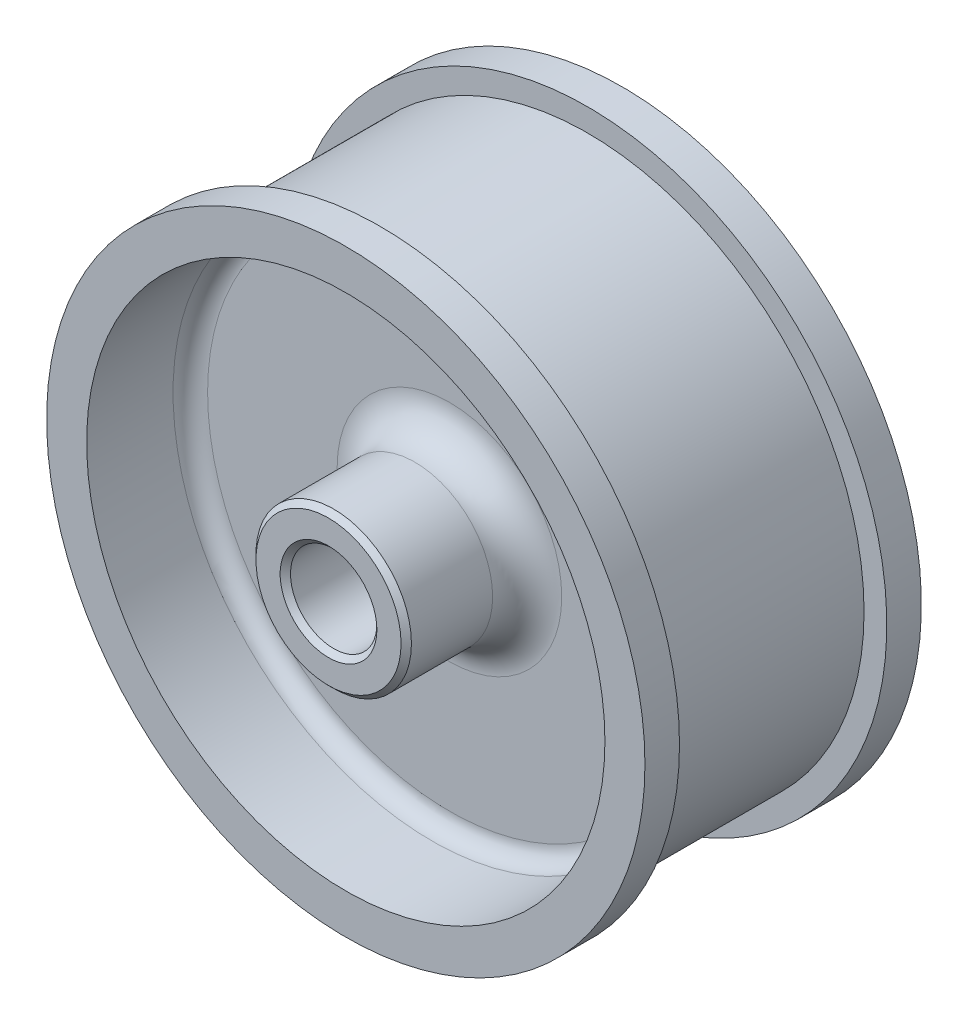
ISO-10303-21;
HEADER;
FILE_DESCRIPTION(('STEP AP214'),'2;1');
FILE_NAME('part.step','',(''),(''),'','','');
FILE_SCHEMA(('AUTOMOTIVE_DESIGN { 1 0 10303 214 1 1 1 1 }'));
ENDSEC;
DATA;
#1=APPLICATION_CONTEXT('core data for automotive mechanical design processes');
#2=APPLICATION_PROTOCOL_DEFINITION('international standard','automotive_design',2000,#1);
#3=PRODUCT_CONTEXT('',#1,'mechanical');
#4=PRODUCT('Part','Part','',(#3));
#5=PRODUCT_RELATED_PRODUCT_CATEGORY('part','',(#4));
#6=PRODUCT_DEFINITION_FORMATION('','',#4);
#7=PRODUCT_DEFINITION_CONTEXT('part definition',#1,'design');
#8=PRODUCT_DEFINITION('design','',#6,#7);
#9=PRODUCT_DEFINITION_SHAPE('','',#8);
#10=(LENGTH_UNIT() NAMED_UNIT(*) SI_UNIT(.MILLI.,.METRE.));
#11=(NAMED_UNIT(*) PLANE_ANGLE_UNIT() SI_UNIT($,.RADIAN.));
#12=(NAMED_UNIT(*) SI_UNIT($,.STERADIAN.) SOLID_ANGLE_UNIT());
#13=UNCERTAINTY_MEASURE_WITH_UNIT(LENGTH_MEASURE(1.E-05),#10,'distance_accuracy_value','');
#14=(GEOMETRIC_REPRESENTATION_CONTEXT(3) GLOBAL_UNCERTAINTY_ASSIGNED_CONTEXT((#13)) GLOBAL_UNIT_ASSIGNED_CONTEXT((#10,
#11,#12)) REPRESENTATION_CONTEXT('',''));
#15=CARTESIAN_POINT('',(0.,0.,0.));
#16=DIRECTION('',(0.,0.,1.));
#17=DIRECTION('',(1.,0.,0.));
#18=AXIS2_PLACEMENT_3D('',#15,#16,#17);
#19=CARTESIAN_POINT('',(0.,0.,1.));
#20=DIRECTION('',(0.,0.,1.));
#21=DIRECTION('',(1.,0.,0.));
#22=AXIS2_PLACEMENT_3D('',#19,#20,#21);
#23=PLANE('',#22);
#24=CARTESIAN_POINT('',(0.,0.,1.));
#25=DIRECTION('',(0.,0.,1.));
#26=DIRECTION('',(1.,0.,0.));
#27=AXIS2_PLACEMENT_3D('',#24,#25,#26);
#28=CIRCLE('',#27,7.);
#29=CARTESIAN_POINT('',(7.,0.,1.));
#30=VERTEX_POINT('',#29);
#31=EDGE_CURVE('E85',#30,#30,#28,.T.);
#32=ORIENTED_EDGE('',*,*,#31,.T.);
#33=EDGE_LOOP('',(#32));
#34=FACE_BOUND('',#33,.T.);
#35=CARTESIAN_POINT('',(0.,0.,1.));
#36=DIRECTION('',(0.,0.,1.));
#37=DIRECTION('',(1.,0.,0.));
#38=AXIS2_PLACEMENT_3D('',#35,#36,#37);
#39=CIRCLE('',#38,3.25);
#40=CARTESIAN_POINT('',(3.25,0.,1.));
#41=VERTEX_POINT('',#40);
#42=EDGE_CURVE('E109',#41,#41,#39,.F.);
#43=ORIENTED_EDGE('',*,*,#42,.T.);
#44=EDGE_LOOP('',(#43));
#45=FACE_BOUND('',#44,.T.);
#46=ADVANCED_FACE('F44',(#34,#45),#23,.T.);
#47=CARTESIAN_POINT('',(0.,0.,-1.));
#48=DIRECTION('',(0.,0.,1.));
#49=DIRECTION('',(1.,0.,0.));
#50=AXIS2_PLACEMENT_3D('',#47,#48,#49);
#51=PLANE('',#50);
#52=CARTESIAN_POINT('',(0.,0.,-1.));
#53=DIRECTION('',(0.,0.,1.));
#54=DIRECTION('',(1.,0.,0.));
#55=AXIS2_PLACEMENT_3D('',#52,#53,#54);
#56=CIRCLE('',#55,7.);
#57=CARTESIAN_POINT('',(7.,0.,-1.));
#58=VERTEX_POINT('',#57);
#59=EDGE_CURVE('E97',#58,#58,#56,.F.);
#60=ORIENTED_EDGE('',*,*,#59,.T.);
#61=EDGE_LOOP('',(#60));
#62=FACE_BOUND('',#61,.T.);
#63=CARTESIAN_POINT('',(0.,0.,-1.));
#64=DIRECTION('',(0.,0.,1.));
#65=DIRECTION('',(1.,0.,0.));
#66=AXIS2_PLACEMENT_3D('',#63,#64,#65);
#67=CIRCLE('',#66,3.25);
#68=CARTESIAN_POINT('',(3.25,0.,-1.));
#69=VERTEX_POINT('',#68);
#70=EDGE_CURVE('E105',#69,#69,#67,.T.);
#71=ORIENTED_EDGE('',*,*,#70,.T.);
#72=EDGE_LOOP('',(#71));
#73=FACE_BOUND('',#72,.T.);
#74=ADVANCED_FACE('F170',(#62,#73),#51,.F.);
#75=CARTESIAN_POINT('',(0.,0.,4.5));
#76=DIRECTION('',(0.,0.,-1.));
#77=DIRECTION('',(-1.,0.,0.));
#78=AXIS2_PLACEMENT_3D('',#75,#76,#77);
#79=CYLINDRICAL_SURFACE('',#78,2.25);
#80=CARTESIAN_POINT('',(0.,0.,-4.35));
#81=DIRECTION('',(0.,0.,1.));
#82=DIRECTION('',(1.,0.,0.));
#83=AXIS2_PLACEMENT_3D('',#80,#81,#82);
#84=CIRCLE('',#83,2.25);
#85=CARTESIAN_POINT('',(2.25,0.,-4.35));
#86=VERTEX_POINT('',#85);
#87=EDGE_CURVE('E81',#86,#86,#84,.T.);
#88=ORIENTED_EDGE('',*,*,#87,.T.);
#89=EDGE_LOOP('',(#88));
#90=FACE_BOUND('',#89,.T.);
#91=CARTESIAN_POINT('',(0.,0.,-2.));
#92=DIRECTION('',(0.,0.,1.));
#93=DIRECTION('',(1.,0.,0.));
#94=AXIS2_PLACEMENT_3D('',#91,#92,#93);
#95=CIRCLE('',#94,2.25);
#96=CARTESIAN_POINT('',(2.25,0.,-2.));
#97=VERTEX_POINT('',#96);
#98=EDGE_CURVE('E101',#97,#97,#95,.F.);
#99=ORIENTED_EDGE('',*,*,#98,.T.);
#100=EDGE_LOOP('',(#99));
#101=FACE_BOUND('',#100,.T.);
#102=ADVANCED_FACE('F177',(#90,#101),#79,.T.);
#103=CARTESIAN_POINT('',(0.,0.,4.5));
#104=DIRECTION('',(0.,0.,1.));
#105=DIRECTION('',(1.,0.,0.));
#106=AXIS2_PLACEMENT_3D('',#103,#104,#105);
#107=PLANE('',#106);
#108=CARTESIAN_POINT('',(0.,0.,4.5));
#109=DIRECTION('',(0.,0.,1.));
#110=DIRECTION('',(1.,0.,0.));
#111=AXIS2_PLACEMENT_3D('',#108,#109,#110);
#112=CIRCLE('',#111,1.40000000000001);
#113=CARTESIAN_POINT('',(1.40000000000001,0.,4.5));
#114=VERTEX_POINT('',#113);
#115=EDGE_CURVE('E53',#114,#114,#112,.F.);
#116=ORIENTED_EDGE('',*,*,#115,.T.);
#117=EDGE_LOOP('',(#116));
#118=FACE_BOUND('',#117,.T.);
#119=CARTESIAN_POINT('',(0.,0.,4.5));
#120=DIRECTION('',(0.,0.,1.));
#121=DIRECTION('',(1.,0.,0.));
#122=AXIS2_PLACEMENT_3D('',#119,#120,#121);
#123=CIRCLE('',#122,2.1);
#124=CARTESIAN_POINT('',(2.1,0.,4.5));
#125=VERTEX_POINT('',#124);
#126=EDGE_CURVE('E58',#125,#125,#123,.T.);
#127=ORIENTED_EDGE('',*,*,#126,.T.);
#128=EDGE_LOOP('',(#127));
#129=FACE_BOUND('',#128,.T.);
#130=ADVANCED_FACE('F191',(#118,#129),#107,.T.);
#131=CARTESIAN_POINT('',(0.,0.,-4.5));
#132=DIRECTION('',(0.,0.,1.));
#133=DIRECTION('',(1.,0.,0.));
#134=AXIS2_PLACEMENT_3D('',#131,#132,#133);
#135=PLANE('',#134);
#136=CARTESIAN_POINT('',(0.,0.,-4.5));
#137=DIRECTION('',(0.,0.,1.));
#138=DIRECTION('',(1.,0.,0.));
#139=AXIS2_PLACEMENT_3D('',#136,#137,#138);
#140=CIRCLE('',#139,2.1);
#141=CARTESIAN_POINT('',(2.1,0.,-4.5));
#142=VERTEX_POINT('',#141);
#143=EDGE_CURVE('E73',#142,#142,#140,.F.);
#144=ORIENTED_EDGE('',*,*,#143,.T.);
#145=EDGE_LOOP('',(#144));
#146=FACE_BOUND('',#145,.T.);
#147=CARTESIAN_POINT('',(0.,0.,-4.5));
#148=DIRECTION('',(0.,0.,1.));
#149=DIRECTION('',(1.,0.,0.));
#150=AXIS2_PLACEMENT_3D('',#147,#148,#149);
#151=CIRCLE('',#150,1.4);
#152=CARTESIAN_POINT('',(-1.4,0.,-4.5));
#153=VERTEX_POINT('',#152);
#154=EDGE_CURVE('E77',#153,#153,#151,.T.);
#155=ORIENTED_EDGE('',*,*,#154,.T.);
#156=EDGE_LOOP('',(#155));
#157=FACE_BOUND('',#156,.T.);
#158=ADVANCED_FACE('F194',(#146,#157),#135,.F.);
#159=CARTESIAN_POINT('',(0.,0.,4.35));
#160=DIRECTION('',(0.,0.,1.));
#161=DIRECTION('',(1.,0.,0.));
#162=AXIS2_PLACEMENT_3D('',#159,#160,#161);
#163=CIRCLE('',#162,2.25);
#164=CARTESIAN_POINT('',(2.25,0.,4.35));
#165=VERTEX_POINT('',#164);
#166=EDGE_CURVE('E10',#165,#165,#163,.F.);
#167=ORIENTED_EDGE('',*,*,#166,.T.);
#168=EDGE_LOOP('',(#167));
#169=FACE_BOUND('',#168,.T.);
#170=CARTESIAN_POINT('',(0.,0.,2.));
#171=DIRECTION('',(0.,0.,1.));
#172=DIRECTION('',(1.,0.,0.));
#173=AXIS2_PLACEMENT_3D('',#170,#171,#172);
#174=CIRCLE('',#173,2.25);
#175=CARTESIAN_POINT('',(2.25,0.,2.));
#176=VERTEX_POINT('',#175);
#177=EDGE_CURVE('E113',#176,#176,#174,.T.);
#178=ORIENTED_EDGE('',*,*,#177,.T.);
#179=EDGE_LOOP('',(#178));
#180=FACE_BOUND('',#179,.T.);
#181=ADVANCED_FACE('F189',(#169,#180),#79,.T.);
#182=CARTESIAN_POINT('',(0.,0.,4.5));
#183=DIRECTION('',(0.,0.,-1.));
#184=DIRECTION('',(-1.,0.,0.));
#185=AXIS2_PLACEMENT_3D('',#182,#183,#184);
#186=CYLINDRICAL_SURFACE('',#185,1.25);
#187=CARTESIAN_POINT('',(0.,0.,-4.35));
#188=DIRECTION('',(0.,0.,1.));
#189=DIRECTION('',(1.,0.,0.));
#190=AXIS2_PLACEMENT_3D('',#187,#188,#189);
#191=CIRCLE('',#190,1.25);
#192=CARTESIAN_POINT('',(-1.25,0.,-4.35));
#193=VERTEX_POINT('',#192);
#194=EDGE_CURVE('E63',#193,#193,#191,.F.);
#195=ORIENTED_EDGE('',*,*,#194,.T.);
#196=EDGE_LOOP('',(#195));
#197=FACE_BOUND('',#196,.T.);
#198=CARTESIAN_POINT('',(0.,0.,4.35));
#199=DIRECTION('',(0.,0.,1.));
#200=DIRECTION('',(1.,0.,0.));
#201=AXIS2_PLACEMENT_3D('',#198,#199,#200);
#202=CIRCLE('',#201,1.25);
#203=CARTESIAN_POINT('',(1.25,0.,4.35));
#204=VERTEX_POINT('',#203);
#205=EDGE_CURVE('E69',#204,#204,#202,.T.);
#206=ORIENTED_EDGE('',*,*,#205,.T.);
#207=EDGE_LOOP('',(#206));
#208=FACE_BOUND('',#207,.T.);
#209=ADVANCED_FACE('F185',(#197,#208),#186,.F.);
#210=CARTESIAN_POINT('',(0.,0.,2.));
#211=DIRECTION('',(0.,0.,1.));
#212=DIRECTION('',(1.,0.,0.));
#213=AXIS2_PLACEMENT_3D('',#210,#211,#212);
#214=TOROIDAL_SURFACE('',#213,3.25,1.);
#215=ORIENTED_EDGE('',*,*,#42,.F.);
#216=EDGE_LOOP('',(#215));
#217=FACE_BOUND('',#216,.T.);
#218=ORIENTED_EDGE('',*,*,#177,.F.);
#219=EDGE_LOOP('',(#218));
#220=FACE_BOUND('',#219,.T.);
#221=ADVANCED_FACE('F188',(#217,#220),#214,.F.);
#222=CARTESIAN_POINT('',(0.,0.,-2.));
#223=DIRECTION('',(0.,0.,1.));
#224=DIRECTION('',(1.,0.,0.));
#225=AXIS2_PLACEMENT_3D('',#222,#223,#224);
#226=TOROIDAL_SURFACE('',#225,3.25,1.);
#227=ORIENTED_EDGE('',*,*,#98,.F.);
#228=EDGE_LOOP('',(#227));
#229=FACE_BOUND('',#228,.T.);
#230=ORIENTED_EDGE('',*,*,#70,.F.);
#231=EDGE_LOOP('',(#230));
#232=FACE_BOUND('',#231,.T.);
#233=ADVANCED_FACE('F202',(#229,#232),#226,.F.);
#234=CARTESIAN_POINT('',(0.,0.,3.));
#235=DIRECTION('',(0.,0.,-1.));
#236=DIRECTION('',(-1.,0.,0.));
#237=AXIS2_PLACEMENT_3D('',#234,#235,#236);
#238=CYLINDRICAL_SURFACE('',#237,7.5);
#239=CARTESIAN_POINT('',(0.,0.,-1.5));
#240=DIRECTION('',(0.,0.,1.));
#241=DIRECTION('',(1.,0.,0.));
#242=AXIS2_PLACEMENT_3D('',#239,#240,#241);
#243=CIRCLE('',#242,7.5);
#244=CARTESIAN_POINT('',(7.5,0.,-1.5));
#245=VERTEX_POINT('',#244);
#246=EDGE_CURVE('E93',#245,#245,#243,.T.);
#247=ORIENTED_EDGE('',*,*,#246,.T.);
#248=EDGE_LOOP('',(#247));
#249=FACE_BOUND('',#248,.T.);
#250=CARTESIAN_POINT('',(0.,0.,-4.));
#251=DIRECTION('',(0.,0.,-1.));
#252=DIRECTION('',(-1.,0.,0.));
#253=AXIS2_PLACEMENT_3D('',#250,#251,#252);
#254=CIRCLE('',#253,7.5);
#255=CARTESIAN_POINT('',(-7.5,0.,-4.));
#256=VERTEX_POINT('',#255);
#257=EDGE_CURVE('E142',#256,#256,#254,.T.);
#258=ORIENTED_EDGE('',*,*,#257,.T.);
#259=EDGE_LOOP('',(#258));
#260=FACE_BOUND('',#259,.T.);
#261=ADVANCED_FACE('F150',(#249,#260),#238,.F.);
#262=CARTESIAN_POINT('',(0.,0.,3.));
#263=DIRECTION('',(0.,0.,-1.));
#264=DIRECTION('',(-1.,0.,0.));
#265=AXIS2_PLACEMENT_3D('',#262,#263,#264);
#266=CYLINDRICAL_SURFACE('',#265,8.);
#267=CARTESIAN_POINT('',(0.,0.,3.));
#268=DIRECTION('',(0.,0.,1.));
#269=DIRECTION('',(1.,0.,0.));
#270=AXIS2_PLACEMENT_3D('',#267,#268,#269);
#271=CIRCLE('',#270,8.);
#272=CARTESIAN_POINT('',(8.,0.,3.));
#273=VERTEX_POINT('',#272);
#274=EDGE_CURVE('E117',#273,#273,#271,.T.);
#275=ORIENTED_EDGE('',*,*,#274,.F.);
#276=EDGE_LOOP('',(#275));
#277=FACE_BOUND('',#276,.T.);
#278=CARTESIAN_POINT('',(0.,0.,-3.));
#279=DIRECTION('',(0.,0.,1.));
#280=DIRECTION('',(1.,0.,0.));
#281=AXIS2_PLACEMENT_3D('',#278,#279,#280);
#282=CIRCLE('',#281,8.);
#283=CARTESIAN_POINT('',(8.,0.,-3.));
#284=VERTEX_POINT('',#283);
#285=EDGE_CURVE('E118',#284,#284,#282,.T.);
#286=ORIENTED_EDGE('',*,*,#285,.T.);
#287=EDGE_LOOP('',(#286));
#288=FACE_BOUND('',#287,.T.);
#289=ADVANCED_FACE('F182',(#277,#288),#266,.T.);
#290=CARTESIAN_POINT('',(0.,0.,1.5));
#291=DIRECTION('',(0.,0.,1.));
#292=DIRECTION('',(1.,0.,0.));
#293=AXIS2_PLACEMENT_3D('',#290,#291,#292);
#294=CIRCLE('',#293,7.5);
#295=CARTESIAN_POINT('',(7.5,0.,1.5));
#296=VERTEX_POINT('',#295);
#297=EDGE_CURVE('E89',#296,#296,#294,.F.);
#298=ORIENTED_EDGE('',*,*,#297,.T.);
#299=EDGE_LOOP('',(#298));
#300=FACE_BOUND('',#299,.T.);
#301=CARTESIAN_POINT('',(0.,0.,4.));
#302=DIRECTION('',(0.,0.,1.));
#303=DIRECTION('',(1.,0.,0.));
#304=AXIS2_PLACEMENT_3D('',#301,#302,#303);
#305=CIRCLE('',#304,7.5);
#306=CARTESIAN_POINT('',(7.5,0.,4.));
#307=VERTEX_POINT('',#306);
#308=EDGE_CURVE('E122',#307,#307,#305,.T.);
#309=ORIENTED_EDGE('',*,*,#308,.T.);
#310=EDGE_LOOP('',(#309));
#311=FACE_BOUND('',#310,.T.);
#312=ADVANCED_FACE('F211',(#300,#311),#238,.F.);
#313=CARTESIAN_POINT('',(0.,0.,-1.5));
#314=DIRECTION('',(0.,0.,1.));
#315=DIRECTION('',(1.,0.,0.));
#316=AXIS2_PLACEMENT_3D('',#313,#314,#315);
#317=TOROIDAL_SURFACE('',#316,7.,0.5);
#318=ORIENTED_EDGE('',*,*,#246,.F.);
#319=EDGE_LOOP('',(#318));
#320=FACE_BOUND('',#319,.T.);
#321=ORIENTED_EDGE('',*,*,#59,.F.);
#322=EDGE_LOOP('',(#321));
#323=FACE_BOUND('',#322,.T.);
#324=ADVANCED_FACE('F207',(#320,#323),#317,.F.);
#325=CARTESIAN_POINT('',(0.,0.,1.5));
#326=DIRECTION('',(0.,0.,1.));
#327=DIRECTION('',(1.,0.,0.));
#328=AXIS2_PLACEMENT_3D('',#325,#326,#327);
#329=TOROIDAL_SURFACE('',#328,7.,0.5);
#330=ORIENTED_EDGE('',*,*,#31,.F.);
#331=EDGE_LOOP('',(#330));
#332=FACE_BOUND('',#331,.T.);
#333=ORIENTED_EDGE('',*,*,#297,.F.);
#334=EDGE_LOOP('',(#333));
#335=FACE_BOUND('',#334,.T.);
#336=ADVANCED_FACE('F210',(#332,#335),#329,.F.);
#337=CARTESIAN_POINT('',(0.,0.,4.));
#338=DIRECTION('',(0.,0.,1.));
#339=DIRECTION('',(1.,0.,0.));
#340=AXIS2_PLACEMENT_3D('',#337,#338,#339);
#341=PLANE('',#340);
#342=CARTESIAN_POINT('',(0.,0.,4.));
#343=DIRECTION('',(0.,0.,1.));
#344=DIRECTION('',(1.,0.,0.));
#345=AXIS2_PLACEMENT_3D('',#342,#343,#344);
#346=CIRCLE('',#345,8.65834889949589);
#347=CARTESIAN_POINT('',(8.65834889949589,0.,4.));
#348=VERTEX_POINT('',#347);
#349=EDGE_CURVE('E127',#348,#348,#346,.T.);
#350=ORIENTED_EDGE('',*,*,#349,.T.);
#351=EDGE_LOOP('',(#350));
#352=FACE_BOUND('',#351,.T.);
#353=ORIENTED_EDGE('',*,*,#308,.F.);
#354=EDGE_LOOP('',(#353));
#355=FACE_BOUND('',#354,.T.);
#356=ADVANCED_FACE('F215',(#352,#355),#341,.T.);
#357=CARTESIAN_POINT('',(0.,0.,3.));
#358=DIRECTION('',(0.,0.,1.));
#359=DIRECTION('',(1.,0.,0.));
#360=AXIS2_PLACEMENT_3D('',#357,#358,#359);
#361=PLANE('',#360);
#362=ORIENTED_EDGE('',*,*,#274,.T.);
#363=EDGE_LOOP('',(#362));
#364=FACE_BOUND('',#363,.T.);
#365=CARTESIAN_POINT('',(0.,0.,3.));
#366=DIRECTION('',(0.,0.,1.));
#367=DIRECTION('',(1.,0.,0.));
#368=AXIS2_PLACEMENT_3D('',#365,#366,#367);
#369=CIRCLE('',#368,8.65834889949589);
#370=CARTESIAN_POINT('',(8.65834889949589,0.,3.));
#371=VERTEX_POINT('',#370);
#372=EDGE_CURVE('E128',#371,#371,#369,.T.);
#373=ORIENTED_EDGE('',*,*,#372,.F.);
#374=EDGE_LOOP('',(#373));
#375=FACE_BOUND('',#374,.T.);
#376=ADVANCED_FACE('F166',(#364,#375),#361,.F.);
#377=CARTESIAN_POINT('',(0.,0.,4.));
#378=DIRECTION('',(0.,0.,-1.));
#379=DIRECTION('',(-1.,0.,0.));
#380=AXIS2_PLACEMENT_3D('',#377,#378,#379);
#381=CYLINDRICAL_SURFACE('',#380,8.65834889949589);
#382=ORIENTED_EDGE('',*,*,#349,.F.);
#383=EDGE_LOOP('',(#382));
#384=FACE_BOUND('',#383,.T.);
#385=ORIENTED_EDGE('',*,*,#372,.T.);
#386=EDGE_LOOP('',(#385));
#387=FACE_BOUND('',#386,.T.);
#388=ADVANCED_FACE('F155',(#384,#387),#381,.T.);
#389=CARTESIAN_POINT('',(0.,0.,-4.));
#390=DIRECTION('',(0.,0.,-1.));
#391=DIRECTION('',(-1.,0.,0.));
#392=AXIS2_PLACEMENT_3D('',#389,#390,#391);
#393=PLANE('',#392);
#394=CARTESIAN_POINT('',(0.,0.,-4.));
#395=DIRECTION('',(0.,0.,-1.));
#396=DIRECTION('',(-1.,0.,0.));
#397=AXIS2_PLACEMENT_3D('',#394,#395,#396);
#398=CIRCLE('',#397,8.65834889949589);
#399=CARTESIAN_POINT('',(-8.65834889949589,0.,-4.));
#400=VERTEX_POINT('',#399);
#401=EDGE_CURVE('E123',#400,#400,#398,.T.);
#402=ORIENTED_EDGE('',*,*,#401,.T.);
#403=EDGE_LOOP('',(#402));
#404=FACE_BOUND('',#403,.T.);
#405=ORIENTED_EDGE('',*,*,#257,.F.);
#406=EDGE_LOOP('',(#405));
#407=FACE_BOUND('',#406,.T.);
#408=ADVANCED_FACE('F152',(#404,#407),#393,.T.);
#409=CARTESIAN_POINT('',(0.,0.,-3.));
#410=DIRECTION('',(0.,0.,-1.));
#411=DIRECTION('',(-1.,0.,0.));
#412=AXIS2_PLACEMENT_3D('',#409,#410,#411);
#413=PLANE('',#412);
#414=ORIENTED_EDGE('',*,*,#285,.F.);
#415=EDGE_LOOP('',(#414));
#416=FACE_BOUND('',#415,.T.);
#417=CARTESIAN_POINT('',(0.,0.,-3.));
#418=DIRECTION('',(0.,0.,-1.));
#419=DIRECTION('',(-1.,0.,0.));
#420=AXIS2_PLACEMENT_3D('',#417,#418,#419);
#421=CIRCLE('',#420,8.65834889949589);
#422=CARTESIAN_POINT('',(-8.65834889949589,0.,-3.));
#423=VERTEX_POINT('',#422);
#424=EDGE_CURVE('E138',#423,#423,#421,.T.);
#425=ORIENTED_EDGE('',*,*,#424,.F.);
#426=EDGE_LOOP('',(#425));
#427=FACE_BOUND('',#426,.T.);
#428=ADVANCED_FACE('F154',(#416,#427),#413,.F.);
#429=CARTESIAN_POINT('',(0.,0.,-4.));
#430=DIRECTION('',(0.,0.,1.));
#431=DIRECTION('',(1.,0.,0.));
#432=AXIS2_PLACEMENT_3D('',#429,#430,#431);
#433=CYLINDRICAL_SURFACE('',#432,8.65834889949589);
#434=ORIENTED_EDGE('',*,*,#401,.F.);
#435=EDGE_LOOP('',(#434));
#436=FACE_BOUND('',#435,.T.);
#437=ORIENTED_EDGE('',*,*,#424,.T.);
#438=EDGE_LOOP('',(#437));
#439=FACE_BOUND('',#438,.T.);
#440=ADVANCED_FACE('F162',(#436,#439),#433,.T.);
#441=CARTESIAN_POINT('',(0.,0.,-4.35));
#442=DIRECTION('',(0.,0.,1.));
#443=DIRECTION('',(1.,0.,0.));
#444=AXIS2_PLACEMENT_3D('',#441,#442,#443);
#445=CONICAL_SURFACE('',#444,2.25,0.785398163397464);
#446=ORIENTED_EDGE('',*,*,#143,.F.);
#447=EDGE_LOOP('',(#446));
#448=FACE_BOUND('',#447,.T.);
#449=ORIENTED_EDGE('',*,*,#87,.F.);
#450=EDGE_LOOP('',(#449));
#451=FACE_BOUND('',#450,.T.);
#452=ADVANCED_FACE('F218',(#448,#451),#445,.T.);
#453=CARTESIAN_POINT('',(0.,0.,-4.5));
#454=DIRECTION('',(0.,0.,-1.));
#455=DIRECTION('',(-1.,0.,0.));
#456=AXIS2_PLACEMENT_3D('',#453,#454,#455);
#457=CONICAL_SURFACE('',#456,1.4,0.785398163397446);
#458=CARTESIAN_POINT('',(-1.25,0.,-4.35));
#459=CARTESIAN_POINT('',(-1.2515625,0.,-4.3515625));
#460=CARTESIAN_POINT('',(-1.253125,0.,-4.353125));
#461=CARTESIAN_POINT('',(-1.25625,0.,-4.35625));
#462=CARTESIAN_POINT('',(-1.2578125,0.,-4.3578125));
#463=CARTESIAN_POINT('',(-1.2609375,0.,-4.3609375));
#464=CARTESIAN_POINT('',(-1.2625,0.,-4.3625));
#465=CARTESIAN_POINT('',(-1.265625,0.,-4.365625));
#466=CARTESIAN_POINT('',(-1.2671875,0.,-4.3671875));
#467=CARTESIAN_POINT('',(-1.2703125,0.,-4.3703125));
#468=CARTESIAN_POINT('',(-1.271875,0.,-4.371875));
#469=CARTESIAN_POINT('',(-1.275,0.,-4.375));
#470=CARTESIAN_POINT('',(-1.2765625,0.,-4.3765625));
#471=CARTESIAN_POINT('',(-1.2796875,0.,-4.3796875));
#472=CARTESIAN_POINT('',(-1.28125,0.,-4.38125));
#473=CARTESIAN_POINT('',(-1.284375,0.,-4.384375));
#474=CARTESIAN_POINT('',(-1.2859375,0.,-4.3859375));
#475=CARTESIAN_POINT('',(-1.2890625,0.,-4.3890625));
#476=CARTESIAN_POINT('',(-1.290625,0.,-4.390625));
#477=CARTESIAN_POINT('',(-1.29375,0.,-4.39375));
#478=CARTESIAN_POINT('',(-1.2953125,0.,-4.3953125));
#479=CARTESIAN_POINT('',(-1.2984375,0.,-4.3984375));
#480=CARTESIAN_POINT('',(-1.3,0.,-4.4));
#481=CARTESIAN_POINT('',(-1.303125,0.,-4.403125));
#482=CARTESIAN_POINT('',(-1.3046875,0.,-4.4046875));
#483=CARTESIAN_POINT('',(-1.3078125,0.,-4.4078125));
#484=CARTESIAN_POINT('',(-1.309375,0.,-4.409375));
#485=CARTESIAN_POINT('',(-1.3125,0.,-4.4125));
#486=CARTESIAN_POINT('',(-1.3140625,0.,-4.4140625));
#487=CARTESIAN_POINT('',(-1.3171875,0.,-4.4171875));
#488=CARTESIAN_POINT('',(-1.31875,0.,-4.41875));
#489=CARTESIAN_POINT('',(-1.321875,0.,-4.421875));
#490=CARTESIAN_POINT('',(-1.3234375,0.,-4.4234375));
#491=CARTESIAN_POINT('',(-1.3265625,0.,-4.4265625));
#492=CARTESIAN_POINT('',(-1.328125,0.,-4.428125));
#493=CARTESIAN_POINT('',(-1.33125,0.,-4.43125));
#494=CARTESIAN_POINT('',(-1.3328125,0.,-4.4328125));
#495=CARTESIAN_POINT('',(-1.3359375,0.,-4.4359375));
#496=CARTESIAN_POINT('',(-1.3375,0.,-4.4375));
#497=CARTESIAN_POINT('',(-1.340625,0.,-4.440625));
#498=CARTESIAN_POINT('',(-1.3421875,0.,-4.4421875));
#499=CARTESIAN_POINT('',(-1.3453125,0.,-4.4453125));
#500=CARTESIAN_POINT('',(-1.346875,0.,-4.446875));
#501=CARTESIAN_POINT('',(-1.35,0.,-4.45));
#502=CARTESIAN_POINT('',(-1.3515625,0.,-4.4515625));
#503=CARTESIAN_POINT('',(-1.3546875,0.,-4.4546875));
#504=CARTESIAN_POINT('',(-1.35625,0.,-4.45625));
#505=CARTESIAN_POINT('',(-1.359375,0.,-4.459375));
#506=CARTESIAN_POINT('',(-1.3609375,0.,-4.4609375));
#507=CARTESIAN_POINT('',(-1.3640625,0.,-4.4640625));
#508=CARTESIAN_POINT('',(-1.365625,0.,-4.465625));
#509=CARTESIAN_POINT('',(-1.36875,0.,-4.46875));
#510=CARTESIAN_POINT('',(-1.3703125,0.,-4.4703125));
#511=CARTESIAN_POINT('',(-1.3734375,0.,-4.4734375));
#512=CARTESIAN_POINT('',(-1.375,0.,-4.475));
#513=CARTESIAN_POINT('',(-1.378125,0.,-4.478125));
#514=CARTESIAN_POINT('',(-1.3796875,0.,-4.4796875));
#515=CARTESIAN_POINT('',(-1.3828125,0.,-4.4828125));
#516=CARTESIAN_POINT('',(-1.384375,0.,-4.484375));
#517=CARTESIAN_POINT('',(-1.3875,0.,-4.4875));
#518=CARTESIAN_POINT('',(-1.3890625,0.,-4.4890625));
#519=CARTESIAN_POINT('',(-1.3921875,0.,-4.4921875));
#520=CARTESIAN_POINT('',(-1.39375,0.,-4.49375));
#521=CARTESIAN_POINT('',(-1.396875,0.,-4.496875));
#522=CARTESIAN_POINT('',(-1.3984375,0.,-4.4984375));
#523=CARTESIAN_POINT('',(-1.4,0.,-4.5));
#524=B_SPLINE_CURVE_WITH_KNOTS('',3,(#458,#459,#460,#461,#462,#463,#464,#465,#466,#467,#468,
#469,#470,#471,#472,#473,#474,#475,#476,#477,#478,#479,#480,#481,#482,#483,#484,#485,#486,#487,
#488,#489,#490,#491,#492,#493,#494,#495,#496,#497,#498,#499,#500,#501,#502,#503,#504,#505,#506,
#507,#508,#509,#510,#511,#512,#513,#514,#515,#516,#517,#518,#519,#520,#521,#522,#523),
.UNSPECIFIED.,.F.,.F.,(4,2,2,2,2,2,2,2,2,2,2,2,2,2,2,2,2,2,2,2,2,2,2,2,2,2,2,2,2,2,2,2,4),(0.,
0.00662912607362407,0.0132582521472483,0.0198873782208725,0.026516504294496,0.0331456303681202,
0.0397747564417444,0.0464038825153679,0.0530330085889921,0.0596621346626163,0.0662912607362398,
0.072920386809864,0.0795495128834883,0.0861786389571117,0.092807765030736,0.0994368911043602,
0.106066017177984,0.112695143251608,0.119324269325232,0.125953395398856,0.13258252147248,
0.139211647546104,0.145840773619728,0.152469899693352,0.159099025766976,0.1657281518406,
0.172357277914224,0.178986403987848,0.185615530061472,0.192244656135096,0.19887378220872,
0.205502908282344,0.212132034355967),.UNSPECIFIED.);
#525=EDGE_CURVE('BSEAM224',#193,#153,#524,.T.);
#526=ORIENTED_EDGE('',*,*,#194,.F.);
#527=ORIENTED_EDGE('',*,*,#154,.F.);
#528=ORIENTED_EDGE('',*,*,#525,.T.);
#529=ORIENTED_EDGE('',*,*,#525,.F.);
#530=EDGE_LOOP('',(#526,#528,#527,#529));
#531=FACE_BOUND('',#530,.T.);
#532=ADVANCED_FACE('F224',(#531),#457,.F.);
#533=CARTESIAN_POINT('',(0.,0.,4.35));
#534=DIRECTION('',(0.,0.,1.));
#535=DIRECTION('',(1.,0.,0.));
#536=AXIS2_PLACEMENT_3D('',#533,#534,#535);
#537=CONICAL_SURFACE('',#536,1.25,0.785398163397461);
#538=ORIENTED_EDGE('',*,*,#115,.F.);
#539=EDGE_LOOP('',(#538));
#540=FACE_BOUND('',#539,.T.);
#541=ORIENTED_EDGE('',*,*,#205,.F.);
#542=EDGE_LOOP('',(#541));
#543=FACE_BOUND('',#542,.T.);
#544=ADVANCED_FACE('F230',(#540,#543),#537,.F.);
#545=CARTESIAN_POINT('',(0.,0.,4.5));
#546=DIRECTION('',(0.,0.,-1.));
#547=DIRECTION('',(-1.,0.,0.));
#548=AXIS2_PLACEMENT_3D('',#545,#546,#547);
#549=CONICAL_SURFACE('',#548,2.1,0.785398163397444);
#550=ORIENTED_EDGE('',*,*,#166,.F.);
#551=EDGE_LOOP('',(#550));
#552=FACE_BOUND('',#551,.T.);
#553=ORIENTED_EDGE('',*,*,#126,.F.);
#554=EDGE_LOOP('',(#553));
#555=FACE_BOUND('',#554,.T.);
#556=ADVANCED_FACE('F47',(#552,#555),#549,.T.);
#557=CLOSED_SHELL('',(#46,#74,#102,#130,#158,#181,#209,#221,#233,#261,#289,#312,#324,#336,#356,
#376,#388,#408,#428,#440,#452,#532,#544,#556));
#558=MANIFOLD_SOLID_BREP('B2',#557);
#559=ADVANCED_BREP_SHAPE_REPRESENTATION('',(#18,#558),#14);
#560=SHAPE_DEFINITION_REPRESENTATION(#9,#559);
ENDSEC;
END-ISO-10303-21;
